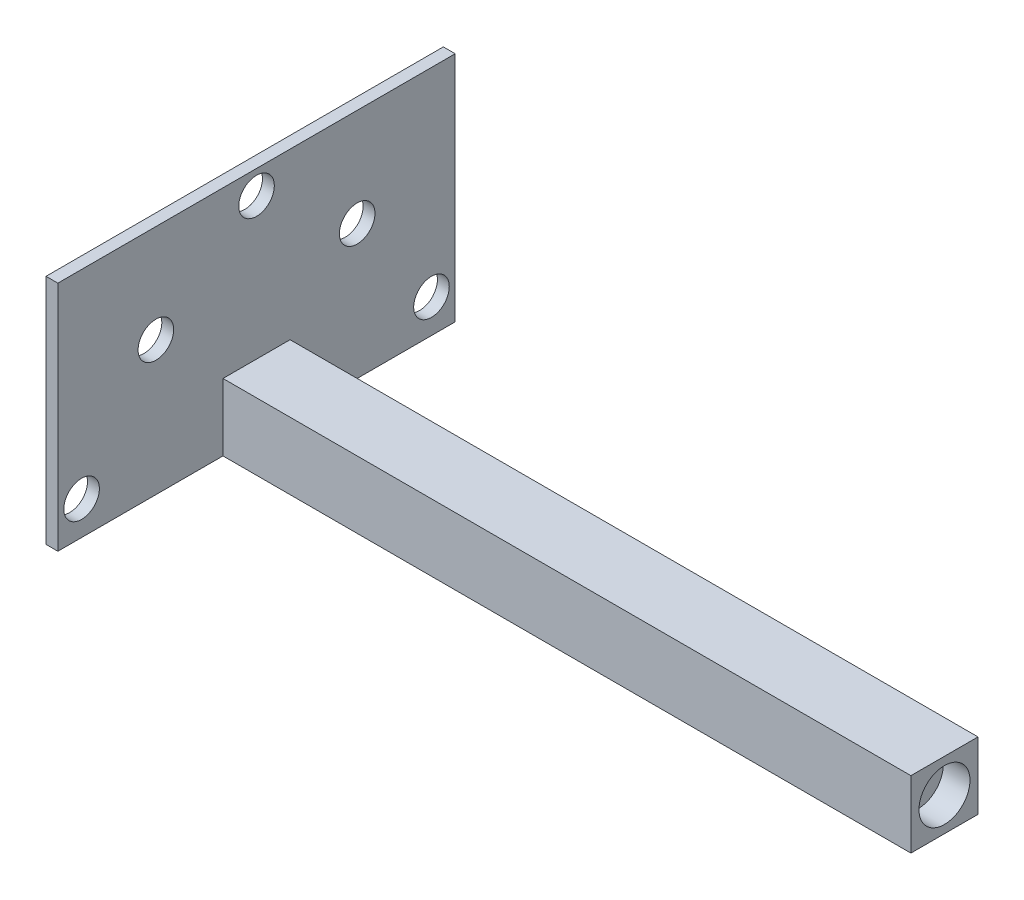
ISO-10303-21;
HEADER;
FILE_DESCRIPTION(('STEP AP214'),'2;1');
FILE_NAME('part.step','',(''),(''),'','','');
FILE_SCHEMA(('AUTOMOTIVE_DESIGN { 1 0 10303 214 1 1 1 1 }'));
ENDSEC;
DATA;
#1=APPLICATION_CONTEXT('core data for automotive mechanical design processes');
#2=APPLICATION_PROTOCOL_DEFINITION('international standard','automotive_design',2000,#1);
#3=PRODUCT_CONTEXT('',#1,'mechanical');
#4=PRODUCT('Part','Part','',(#3));
#5=PRODUCT_RELATED_PRODUCT_CATEGORY('part','',(#4));
#6=PRODUCT_DEFINITION_FORMATION('','',#4);
#7=PRODUCT_DEFINITION_CONTEXT('part definition',#1,'design');
#8=PRODUCT_DEFINITION('design','',#6,#7);
#9=PRODUCT_DEFINITION_SHAPE('','',#8);
#10=(LENGTH_UNIT() NAMED_UNIT(*) SI_UNIT(.MILLI.,.METRE.));
#11=(NAMED_UNIT(*) PLANE_ANGLE_UNIT() SI_UNIT($,.RADIAN.));
#12=(NAMED_UNIT(*) SI_UNIT($,.STERADIAN.) SOLID_ANGLE_UNIT());
#13=UNCERTAINTY_MEASURE_WITH_UNIT(LENGTH_MEASURE(1.E-05),#10,'distance_accuracy_value','');
#14=(GEOMETRIC_REPRESENTATION_CONTEXT(3) GLOBAL_UNCERTAINTY_ASSIGNED_CONTEXT((#13)) GLOBAL_UNIT_ASSIGNED_CONTEXT((#10,
#11,#12)) REPRESENTATION_CONTEXT('',''));
#15=CARTESIAN_POINT('',(0.,0.,0.));
#16=DIRECTION('',(0.,0.,1.));
#17=DIRECTION('',(1.,0.,0.));
#18=AXIS2_PLACEMENT_3D('',#15,#16,#17);
#19=CARTESIAN_POINT('',(1.,0.,0.));
#20=DIRECTION('',(1.,0.,0.));
#21=DIRECTION('',(0.,0.,-1.));
#22=AXIS2_PLACEMENT_3D('',#19,#20,#21);
#23=PLANE('',#22);
#24=CARTESIAN_POINT('',(1.,8.48528137423854,-8.4852813742386));
#25=DIRECTION('',(1.,0.,0.));
#26=DIRECTION('',(0.,0.,-1.));
#27=AXIS2_PLACEMENT_3D('',#24,#25,#26);
#28=CIRCLE('',#27,1.5);
#29=CARTESIAN_POINT('',(1.,8.48528137423854,-9.9852813742386));
#30=VERTEX_POINT('',#29);
#31=EDGE_CURVE('E139',#30,#30,#28,.T.);
#32=ORIENTED_EDGE('',*,*,#31,.F.);
#33=EDGE_LOOP('',(#32));
#34=FACE_BOUND('',#33,.T.);
#35=CARTESIAN_POINT('',(1.,8.48528137423857,8.48528137423857));
#36=DIRECTION('',(1.,0.,0.));
#37=DIRECTION('',(0.,0.,-1.));
#38=AXIS2_PLACEMENT_3D('',#35,#36,#37);
#39=CIRCLE('',#38,1.5);
#40=CARTESIAN_POINT('',(1.,8.48528137423857,6.98528137423857));
#41=VERTEX_POINT('',#40);
#42=EDGE_CURVE('E142',#41,#41,#39,.T.);
#43=ORIENTED_EDGE('',*,*,#42,.F.);
#44=EDGE_LOOP('',(#43));
#45=FACE_BOUND('',#44,.T.);
#46=CARTESIAN_POINT('',(1.,0.,14.75));
#47=DIRECTION('',(1.,0.,0.));
#48=DIRECTION('',(0.,0.,-1.));
#49=AXIS2_PLACEMENT_3D('',#46,#47,#48);
#50=CIRCLE('',#49,1.5);
#51=CARTESIAN_POINT('',(1.,0.,13.25));
#52=VERTEX_POINT('',#51);
#53=EDGE_CURVE('E146',#52,#52,#50,.T.);
#54=ORIENTED_EDGE('',*,*,#53,.F.);
#55=EDGE_LOOP('',(#54));
#56=FACE_BOUND('',#55,.T.);
#57=CARTESIAN_POINT('',(1.,0.,-14.75));
#58=DIRECTION('',(1.,0.,0.));
#59=DIRECTION('',(0.,0.,-1.));
#60=AXIS2_PLACEMENT_3D('',#57,#58,#59);
#61=CIRCLE('',#60,1.5);
#62=CARTESIAN_POINT('',(1.,0.,-16.25));
#63=VERTEX_POINT('',#62);
#64=EDGE_CURVE('E149',#63,#63,#61,.T.);
#65=ORIENTED_EDGE('',*,*,#64,.F.);
#66=EDGE_LOOP('',(#65));
#67=FACE_BOUND('',#66,.T.);
#68=CARTESIAN_POINT('',(1.,14.75,0.));
#69=DIRECTION('',(1.,0.,0.));
#70=DIRECTION('',(0.,0.,-1.));
#71=AXIS2_PLACEMENT_3D('',#68,#69,#70);
#72=CIRCLE('',#71,1.5);
#73=CARTESIAN_POINT('',(1.,14.75,-1.5));
#74=VERTEX_POINT('',#73);
#75=EDGE_CURVE('E152',#74,#74,#72,.T.);
#76=ORIENTED_EDGE('',*,*,#75,.F.);
#77=EDGE_LOOP('',(#76));
#78=FACE_BOUND('',#77,.T.);
#79=DIRECTION('',(0.,0.,1.));
#80=VECTOR('',#79,1.);
#81=CARTESIAN_POINT('',(1.,2.82842712474619,0.));
#82=LINE('',#81,#80);
#83=CARTESIAN_POINT('',(1.,2.82842712474619,-2.82842712474619));
#84=VERTEX_POINT('',#83);
#85=CARTESIAN_POINT('',(1.,2.82842712474619,2.82842712474619));
#86=VERTEX_POINT('',#85);
#87=EDGE_CURVE('E56',#84,#86,#82,.T.);
#88=ORIENTED_EDGE('',*,*,#87,.F.);
#89=DIRECTION('',(0.,-1.,0.));
#90=VECTOR('',#89,1.);
#91=CARTESIAN_POINT('',(1.,0.,-2.82842712474619));
#92=LINE('',#91,#90);
#93=CARTESIAN_POINT('',(1.,-2.82842712474619,-2.82842712474619));
#94=VERTEX_POINT('',#93);
#95=EDGE_CURVE('E136',#84,#94,#92,.T.);
#96=ORIENTED_EDGE('',*,*,#95,.T.);
#97=DIRECTION('',(0.,0.,-1.));
#98=VECTOR('',#97,1.);
#99=CARTESIAN_POINT('',(1.,-2.82842712474619,0.));
#100=LINE('',#99,#98);
#101=CARTESIAN_POINT('',(1.,-2.82842712474619,-16.75));
#102=VERTEX_POINT('',#101);
#103=EDGE_CURVE('E128',#94,#102,#100,.T.);
#104=ORIENTED_EDGE('',*,*,#103,.T.);
#105=DIRECTION('',(0.,1.,0.));
#106=VECTOR('',#105,1.);
#107=CARTESIAN_POINT('',(1.,0.,-16.75));
#108=LINE('',#107,#106);
#109=CARTESIAN_POINT('',(1.,16.75,-16.75));
#110=VERTEX_POINT('',#109);
#111=EDGE_CURVE('E160',#102,#110,#108,.T.);
#112=ORIENTED_EDGE('',*,*,#111,.T.);
#113=DIRECTION('',(0.,0.,-1.));
#114=VECTOR('',#113,1.);
#115=CARTESIAN_POINT('',(1.,16.75,0.));
#116=LINE('',#115,#114);
#117=CARTESIAN_POINT('',(1.,16.75,16.75));
#118=VERTEX_POINT('',#117);
#119=EDGE_CURVE('E162',#118,#110,#116,.T.);
#120=ORIENTED_EDGE('',*,*,#119,.F.);
#121=DIRECTION('',(0.,1.,0.));
#122=VECTOR('',#121,1.);
#123=CARTESIAN_POINT('',(1.,0.,16.75));
#124=LINE('',#123,#122);
#125=CARTESIAN_POINT('',(1.,-2.82842712474619,16.75));
#126=VERTEX_POINT('',#125);
#127=EDGE_CURVE('E155',#126,#118,#124,.T.);
#128=ORIENTED_EDGE('',*,*,#127,.F.);
#129=CARTESIAN_POINT('',(1.,-2.82842712474619,2.82842712474619));
#130=VERTEX_POINT('',#129);
#131=EDGE_CURVE('E158',#126,#130,#100,.T.);
#132=ORIENTED_EDGE('',*,*,#131,.T.);
#133=DIRECTION('',(0.,-1.,0.));
#134=VECTOR('',#133,1.);
#135=CARTESIAN_POINT('',(1.,0.,2.82842712474619));
#136=LINE('',#135,#134);
#137=EDGE_CURVE('E61',#86,#130,#136,.T.);
#138=ORIENTED_EDGE('',*,*,#137,.F.);
#139=EDGE_LOOP('',(#88,#96,#104,#112,#120,#128,#132,#138));
#140=FACE_BOUND('',#139,.T.);
#141=ADVANCED_FACE('F41',(#34,#45,#56,#67,#78,#140),#23,.T.);
#142=CARTESIAN_POINT('',(1.,0.,16.75));
#143=DIRECTION('',(0.,0.,1.));
#144=DIRECTION('',(1.,0.,0.));
#145=AXIS2_PLACEMENT_3D('',#142,#143,#144);
#146=PLANE('',#145);
#147=DIRECTION('',(0.,1.,0.));
#148=VECTOR('',#147,1.);
#149=CARTESIAN_POINT('',(0.,0.,16.75));
#150=LINE('',#149,#148);
#151=CARTESIAN_POINT('',(0.,-2.82842712474619,16.75));
#152=VERTEX_POINT('',#151);
#153=CARTESIAN_POINT('',(0.,16.75,16.75));
#154=VERTEX_POINT('',#153);
#155=EDGE_CURVE('E180',#152,#154,#150,.T.);
#156=ORIENTED_EDGE('',*,*,#155,.F.);
#157=DIRECTION('',(-1.,0.,0.));
#158=VECTOR('',#157,1.);
#159=CARTESIAN_POINT('',(1.,-2.82842712474619,16.75));
#160=LINE('',#159,#158);
#161=EDGE_CURVE('E11',#126,#152,#160,.T.);
#162=ORIENTED_EDGE('',*,*,#161,.F.);
#163=ORIENTED_EDGE('',*,*,#127,.T.);
#164=DIRECTION('',(-1.,0.,0.));
#165=VECTOR('',#164,1.);
#166=CARTESIAN_POINT('',(1.,16.75,16.75));
#167=LINE('',#166,#165);
#168=EDGE_CURVE('E165',#118,#154,#167,.T.);
#169=ORIENTED_EDGE('',*,*,#168,.T.);
#170=EDGE_LOOP('',(#156,#162,#163,#169));
#171=FACE_BOUND('',#170,.T.);
#172=ADVANCED_FACE('F229',(#171),#146,.T.);
#173=CARTESIAN_POINT('',(1.,-2.82842712474619,0.));
#174=DIRECTION('',(0.,1.,0.));
#175=DIRECTION('',(0.,0.,1.));
#176=AXIS2_PLACEMENT_3D('',#173,#174,#175);
#177=PLANE('',#176);
#178=DIRECTION('',(0.,0.,-1.));
#179=VECTOR('',#178,1.);
#180=CARTESIAN_POINT('',(0.,-2.82842712474619,0.));
#181=LINE('',#180,#179);
#182=CARTESIAN_POINT('',(0.,-2.82842712474619,-16.75));
#183=VERTEX_POINT('',#182);
#184=EDGE_CURVE('E183',#152,#183,#181,.T.);
#185=ORIENTED_EDGE('',*,*,#184,.T.);
#186=DIRECTION('',(-1.,0.,0.));
#187=VECTOR('',#186,1.);
#188=CARTESIAN_POINT('',(1.,-2.82842712474619,-16.75));
#189=LINE('',#188,#187);
#190=EDGE_CURVE('E49',#102,#183,#189,.T.);
#191=ORIENTED_EDGE('',*,*,#190,.F.);
#192=ORIENTED_EDGE('',*,*,#103,.F.);
#193=DIRECTION('',(-1.,0.,0.));
#194=VECTOR('',#193,1.);
#195=CARTESIAN_POINT('',(59.,-2.82842712474619,-2.82842712474619));
#196=LINE('',#195,#194);
#197=CARTESIAN_POINT('',(59.,-2.82842712474619,-2.82842712474619));
#198=VERTEX_POINT('',#197);
#199=EDGE_CURVE('E107',#198,#94,#196,.T.);
#200=ORIENTED_EDGE('',*,*,#199,.F.);
#201=DIRECTION('',(0.,0.,-1.));
#202=VECTOR('',#201,1.);
#203=CARTESIAN_POINT('',(59.,-2.82842712474619,0.));
#204=LINE('',#203,#202);
#205=CARTESIAN_POINT('',(59.,-2.82842712474619,2.82842712474619));
#206=VERTEX_POINT('',#205);
#207=EDGE_CURVE('E114',#206,#198,#204,.T.);
#208=ORIENTED_EDGE('',*,*,#207,.F.);
#209=DIRECTION('',(-1.,0.,0.));
#210=VECTOR('',#209,1.);
#211=CARTESIAN_POINT('',(59.,-2.82842712474619,2.82842712474619));
#212=LINE('',#211,#210);
#213=EDGE_CURVE('E213',#206,#130,#212,.T.);
#214=ORIENTED_EDGE('',*,*,#213,.T.);
#215=ORIENTED_EDGE('',*,*,#131,.F.);
#216=ORIENTED_EDGE('',*,*,#161,.T.);
#217=EDGE_LOOP('',(#185,#191,#192,#200,#208,#214,#215,#216));
#218=FACE_BOUND('',#217,.T.);
#219=ADVANCED_FACE('F126',(#218),#177,.F.);
#220=CARTESIAN_POINT('',(1.,0.,-16.75));
#221=DIRECTION('',(0.,0.,1.));
#222=DIRECTION('',(1.,0.,0.));
#223=AXIS2_PLACEMENT_3D('',#220,#221,#222);
#224=PLANE('',#223);
#225=DIRECTION('',(0.,1.,0.));
#226=VECTOR('',#225,1.);
#227=CARTESIAN_POINT('',(0.,0.,-16.75));
#228=LINE('',#227,#226);
#229=CARTESIAN_POINT('',(0.,16.75,-16.75));
#230=VERTEX_POINT('',#229);
#231=EDGE_CURVE('E185',#183,#230,#228,.T.);
#232=ORIENTED_EDGE('',*,*,#231,.T.);
#233=DIRECTION('',(-1.,0.,0.));
#234=VECTOR('',#233,1.);
#235=CARTESIAN_POINT('',(1.,16.75,-16.75));
#236=LINE('',#235,#234);
#237=EDGE_CURVE('E191',#110,#230,#236,.T.);
#238=ORIENTED_EDGE('',*,*,#237,.F.);
#239=ORIENTED_EDGE('',*,*,#111,.F.);
#240=ORIENTED_EDGE('',*,*,#190,.T.);
#241=EDGE_LOOP('',(#232,#238,#239,#240));
#242=FACE_BOUND('',#241,.T.);
#243=ADVANCED_FACE('F195',(#242),#224,.F.);
#244=CARTESIAN_POINT('',(1.,14.75,0.));
#245=DIRECTION('',(-1.,0.,0.));
#246=DIRECTION('',(0.,0.,1.));
#247=AXIS2_PLACEMENT_3D('',#244,#245,#246);
#248=CYLINDRICAL_SURFACE('',#247,1.5);
#249=ORIENTED_EDGE('',*,*,#75,.T.);
#250=EDGE_LOOP('',(#249));
#251=FACE_BOUND('',#250,.T.);
#252=CARTESIAN_POINT('',(0.,14.75,0.));
#253=DIRECTION('',(1.,0.,0.));
#254=DIRECTION('',(0.,0.,-1.));
#255=AXIS2_PLACEMENT_3D('',#252,#253,#254);
#256=CIRCLE('',#255,1.5);
#257=CARTESIAN_POINT('',(0.,14.75,-1.5));
#258=VERTEX_POINT('',#257);
#259=EDGE_CURVE('E177',#258,#258,#256,.T.);
#260=ORIENTED_EDGE('',*,*,#259,.F.);
#261=EDGE_LOOP('',(#260));
#262=FACE_BOUND('',#261,.T.);
#263=ADVANCED_FACE('F248',(#251,#262),#248,.F.);
#264=CARTESIAN_POINT('',(1.,0.,-14.75));
#265=DIRECTION('',(-1.,0.,0.));
#266=DIRECTION('',(0.,0.,1.));
#267=AXIS2_PLACEMENT_3D('',#264,#265,#266);
#268=CYLINDRICAL_SURFACE('',#267,1.5);
#269=ORIENTED_EDGE('',*,*,#64,.T.);
#270=EDGE_LOOP('',(#269));
#271=FACE_BOUND('',#270,.T.);
#272=CARTESIAN_POINT('',(0.,0.,-14.75));
#273=DIRECTION('',(1.,0.,0.));
#274=DIRECTION('',(0.,0.,-1.));
#275=AXIS2_PLACEMENT_3D('',#272,#273,#274);
#276=CIRCLE('',#275,1.5);
#277=CARTESIAN_POINT('',(0.,0.,-16.25));
#278=VERTEX_POINT('',#277);
#279=EDGE_CURVE('E174',#278,#278,#276,.T.);
#280=ORIENTED_EDGE('',*,*,#279,.F.);
#281=EDGE_LOOP('',(#280));
#282=FACE_BOUND('',#281,.T.);
#283=ADVANCED_FACE('F252',(#271,#282),#268,.F.);
#284=CARTESIAN_POINT('',(1.,0.,14.75));
#285=DIRECTION('',(-1.,0.,0.));
#286=DIRECTION('',(0.,0.,1.));
#287=AXIS2_PLACEMENT_3D('',#284,#285,#286);
#288=CYLINDRICAL_SURFACE('',#287,1.5);
#289=ORIENTED_EDGE('',*,*,#53,.T.);
#290=EDGE_LOOP('',(#289));
#291=FACE_BOUND('',#290,.T.);
#292=CARTESIAN_POINT('',(0.,0.,14.75));
#293=DIRECTION('',(1.,0.,0.));
#294=DIRECTION('',(0.,0.,-1.));
#295=AXIS2_PLACEMENT_3D('',#292,#293,#294);
#296=CIRCLE('',#295,1.5);
#297=CARTESIAN_POINT('',(0.,0.,13.25));
#298=VERTEX_POINT('',#297);
#299=EDGE_CURVE('E171',#298,#298,#296,.T.);
#300=ORIENTED_EDGE('',*,*,#299,.F.);
#301=EDGE_LOOP('',(#300));
#302=FACE_BOUND('',#301,.T.);
#303=ADVANCED_FACE('F256',(#291,#302),#288,.F.);
#304=CARTESIAN_POINT('',(1.,8.48528137423857,8.48528137423857));
#305=DIRECTION('',(-1.,0.,0.));
#306=DIRECTION('',(0.,0.,1.));
#307=AXIS2_PLACEMENT_3D('',#304,#305,#306);
#308=CYLINDRICAL_SURFACE('',#307,1.5);
#309=ORIENTED_EDGE('',*,*,#42,.T.);
#310=EDGE_LOOP('',(#309));
#311=FACE_BOUND('',#310,.T.);
#312=CARTESIAN_POINT('',(0.,8.48528137423857,8.48528137423857));
#313=DIRECTION('',(1.,0.,0.));
#314=DIRECTION('',(0.,0.,-1.));
#315=AXIS2_PLACEMENT_3D('',#312,#313,#314);
#316=CIRCLE('',#315,1.5);
#317=CARTESIAN_POINT('',(0.,8.48528137423857,6.98528137423857));
#318=VERTEX_POINT('',#317);
#319=EDGE_CURVE('E168',#318,#318,#316,.T.);
#320=ORIENTED_EDGE('',*,*,#319,.F.);
#321=EDGE_LOOP('',(#320));
#322=FACE_BOUND('',#321,.T.);
#323=ADVANCED_FACE('F259',(#311,#322),#308,.F.);
#324=CARTESIAN_POINT('',(1.,8.48528137423854,-8.4852813742386));
#325=DIRECTION('',(-1.,0.,0.));
#326=DIRECTION('',(0.,0.,1.));
#327=AXIS2_PLACEMENT_3D('',#324,#325,#326);
#328=CYLINDRICAL_SURFACE('',#327,1.5);
#329=ORIENTED_EDGE('',*,*,#31,.T.);
#330=EDGE_LOOP('',(#329));
#331=FACE_BOUND('',#330,.T.);
#332=CARTESIAN_POINT('',(0.,8.48528137423854,-8.4852813742386));
#333=DIRECTION('',(1.,0.,0.));
#334=DIRECTION('',(0.,0.,-1.));
#335=AXIS2_PLACEMENT_3D('',#332,#333,#334);
#336=CIRCLE('',#335,1.5);
#337=CARTESIAN_POINT('',(0.,8.48528137423854,-9.9852813742386));
#338=VERTEX_POINT('',#337);
#339=EDGE_CURVE('E138',#338,#338,#336,.T.);
#340=ORIENTED_EDGE('',*,*,#339,.F.);
#341=EDGE_LOOP('',(#340));
#342=FACE_BOUND('',#341,.T.);
#343=ADVANCED_FACE('F43',(#331,#342),#328,.F.);
#344=CARTESIAN_POINT('',(1.,16.75,0.));
#345=DIRECTION('',(0.,1.,0.));
#346=DIRECTION('',(0.,0.,1.));
#347=AXIS2_PLACEMENT_3D('',#344,#345,#346);
#348=PLANE('',#347);
#349=DIRECTION('',(0.,0.,-1.));
#350=VECTOR('',#349,1.);
#351=CARTESIAN_POINT('',(0.,16.75,0.));
#352=LINE('',#351,#350);
#353=EDGE_CURVE('E143',#154,#230,#352,.T.);
#354=ORIENTED_EDGE('',*,*,#353,.F.);
#355=ORIENTED_EDGE('',*,*,#168,.F.);
#356=ORIENTED_EDGE('',*,*,#119,.T.);
#357=ORIENTED_EDGE('',*,*,#237,.T.);
#358=EDGE_LOOP('',(#354,#355,#356,#357));
#359=FACE_BOUND('',#358,.T.);
#360=ADVANCED_FACE('F206',(#359),#348,.T.);
#361=CARTESIAN_POINT('',(0.,0.,0.));
#362=DIRECTION('',(1.,0.,0.));
#363=DIRECTION('',(0.,0.,-1.));
#364=AXIS2_PLACEMENT_3D('',#361,#362,#363);
#365=PLANE('',#364);
#366=ORIENTED_EDGE('',*,*,#231,.F.);
#367=ORIENTED_EDGE('',*,*,#184,.F.);
#368=ORIENTED_EDGE('',*,*,#155,.T.);
#369=ORIENTED_EDGE('',*,*,#353,.T.);
#370=EDGE_LOOP('',(#366,#367,#368,#369));
#371=FACE_BOUND('',#370,.T.);
#372=ORIENTED_EDGE('',*,*,#259,.T.);
#373=EDGE_LOOP('',(#372));
#374=FACE_BOUND('',#373,.T.);
#375=ORIENTED_EDGE('',*,*,#279,.T.);
#376=EDGE_LOOP('',(#375));
#377=FACE_BOUND('',#376,.T.);
#378=ORIENTED_EDGE('',*,*,#299,.T.);
#379=EDGE_LOOP('',(#378));
#380=FACE_BOUND('',#379,.T.);
#381=ORIENTED_EDGE('',*,*,#319,.T.);
#382=EDGE_LOOP('',(#381));
#383=FACE_BOUND('',#382,.T.);
#384=ORIENTED_EDGE('',*,*,#339,.T.);
#385=EDGE_LOOP('',(#384));
#386=FACE_BOUND('',#385,.T.);
#387=ADVANCED_FACE('F202',(#371,#374,#377,#380,#383,#386),#365,.F.);
#388=CARTESIAN_POINT('',(59.,0.,-2.82842712474619));
#389=DIRECTION('',(0.,0.,1.));
#390=DIRECTION('',(1.,0.,0.));
#391=AXIS2_PLACEMENT_3D('',#388,#389,#390);
#392=PLANE('',#391);
#393=ORIENTED_EDGE('',*,*,#95,.F.);
#394=DIRECTION('',(-1.,0.,0.));
#395=VECTOR('',#394,1.);
#396=CARTESIAN_POINT('',(59.,2.82842712474619,-2.82842712474619));
#397=LINE('',#396,#395);
#398=CARTESIAN_POINT('',(59.,2.82842712474619,-2.82842712474619));
#399=VERTEX_POINT('',#398);
#400=EDGE_CURVE('E109',#399,#84,#397,.T.);
#401=ORIENTED_EDGE('',*,*,#400,.F.);
#402=DIRECTION('',(0.,1.,0.));
#403=VECTOR('',#402,1.);
#404=CARTESIAN_POINT('',(59.,0.,-2.82842712474619));
#405=LINE('',#404,#403);
#406=EDGE_CURVE('E103',#198,#399,#405,.T.);
#407=ORIENTED_EDGE('',*,*,#406,.F.);
#408=ORIENTED_EDGE('',*,*,#199,.T.);
#409=EDGE_LOOP('',(#393,#401,#407,#408));
#410=FACE_BOUND('',#409,.T.);
#411=ADVANCED_FACE('F105',(#410),#392,.F.);
#412=CARTESIAN_POINT('',(59.,2.82842712474619,0.));
#413=DIRECTION('',(0.,1.,0.));
#414=DIRECTION('',(0.,0.,1.));
#415=AXIS2_PLACEMENT_3D('',#412,#413,#414);
#416=PLANE('',#415);
#417=ORIENTED_EDGE('',*,*,#400,.T.);
#418=ORIENTED_EDGE('',*,*,#87,.T.);
#419=DIRECTION('',(-1.,0.,0.));
#420=VECTOR('',#419,1.);
#421=CARTESIAN_POINT('',(59.,2.82842712474619,2.82842712474619));
#422=LINE('',#421,#420);
#423=CARTESIAN_POINT('',(59.,2.82842712474619,2.82842712474619));
#424=VERTEX_POINT('',#423);
#425=EDGE_CURVE('E131',#424,#86,#422,.T.);
#426=ORIENTED_EDGE('',*,*,#425,.F.);
#427=DIRECTION('',(0.,0.,-1.));
#428=VECTOR('',#427,1.);
#429=CARTESIAN_POINT('',(59.,2.82842712474619,0.));
#430=LINE('',#429,#428);
#431=EDGE_CURVE('E113',#424,#399,#430,.T.);
#432=ORIENTED_EDGE('',*,*,#431,.T.);
#433=EDGE_LOOP('',(#417,#418,#426,#432));
#434=FACE_BOUND('',#433,.T.);
#435=ADVANCED_FACE('F210',(#434),#416,.T.);
#436=CARTESIAN_POINT('',(59.,0.,2.82842712474619));
#437=DIRECTION('',(0.,0.,1.));
#438=DIRECTION('',(1.,0.,0.));
#439=AXIS2_PLACEMENT_3D('',#436,#437,#438);
#440=PLANE('',#439);
#441=ORIENTED_EDGE('',*,*,#425,.T.);
#442=ORIENTED_EDGE('',*,*,#137,.T.);
#443=ORIENTED_EDGE('',*,*,#213,.F.);
#444=DIRECTION('',(0.,1.,0.));
#445=VECTOR('',#444,1.);
#446=CARTESIAN_POINT('',(59.,0.,2.82842712474619));
#447=LINE('',#446,#445);
#448=EDGE_CURVE('E120',#206,#424,#447,.T.);
#449=ORIENTED_EDGE('',*,*,#448,.T.);
#450=EDGE_LOOP('',(#441,#442,#443,#449));
#451=FACE_BOUND('',#450,.T.);
#452=ADVANCED_FACE('F217',(#451),#440,.T.);
#453=CARTESIAN_POINT('',(59.,0.,0.));
#454=DIRECTION('',(1.,0.,0.));
#455=DIRECTION('',(0.,0.,-1.));
#456=AXIS2_PLACEMENT_3D('',#453,#454,#455);
#457=PLANE('',#456);
#458=CARTESIAN_POINT('',(59.,0.,0.));
#459=DIRECTION('',(1.,0.,0.));
#460=DIRECTION('',(0.,0.,-1.));
#461=AXIS2_PLACEMENT_3D('',#458,#459,#460);
#462=CIRCLE('',#461,2.15);
#463=CARTESIAN_POINT('',(59.,0.,-2.15));
#464=VERTEX_POINT('',#463);
#465=EDGE_CURVE('E371',#464,#464,#462,.T.);
#466=ORIENTED_EDGE('',*,*,#465,.F.);
#467=EDGE_LOOP('',(#466));
#468=FACE_BOUND('',#467,.T.);
#469=ORIENTED_EDGE('',*,*,#207,.T.);
#470=ORIENTED_EDGE('',*,*,#406,.T.);
#471=ORIENTED_EDGE('',*,*,#431,.F.);
#472=ORIENTED_EDGE('',*,*,#448,.F.);
#473=EDGE_LOOP('',(#469,#470,#471,#472));
#474=FACE_BOUND('',#473,.T.);
#475=ADVANCED_FACE('F118',(#468,#474),#457,.T.);
#476=CARTESIAN_POINT('',(56.75,0.,0.));
#477=DIRECTION('',(1.,0.,0.));
#478=DIRECTION('',(0.,0.,-1.));
#479=AXIS2_PLACEMENT_3D('',#476,#477,#478);
#480=CYLINDRICAL_SURFACE('',#479,2.15);
#481=CARTESIAN_POINT('',(56.75,0.,0.));
#482=DIRECTION('',(1.,0.,0.));
#483=DIRECTION('',(0.,0.,-1.));
#484=AXIS2_PLACEMENT_3D('',#481,#482,#483);
#485=CIRCLE('',#484,2.15);
#486=CARTESIAN_POINT('',(56.75,0.,-2.15));
#487=VERTEX_POINT('',#486);
#488=EDGE_CURVE('E123',#487,#487,#485,.T.);
#489=ORIENTED_EDGE('',*,*,#488,.F.);
#490=EDGE_LOOP('',(#489));
#491=FACE_BOUND('',#490,.T.);
#492=ORIENTED_EDGE('',*,*,#465,.T.);
#493=EDGE_LOOP('',(#492));
#494=FACE_BOUND('',#493,.T.);
#495=ADVANCED_FACE('F224',(#491,#494),#480,.F.);
#496=CARTESIAN_POINT('',(56.75,0.,0.));
#497=DIRECTION('',(1.,0.,0.));
#498=DIRECTION('',(0.,0.,-1.));
#499=AXIS2_PLACEMENT_3D('',#496,#497,#498);
#500=PLANE('',#499);
#501=ORIENTED_EDGE('',*,*,#488,.T.);
#502=EDGE_LOOP('',(#501));
#503=FACE_BOUND('',#502,.T.);
#504=ADVANCED_FACE('F356',(#503),#500,.T.);
#505=CLOSED_SHELL('',(#141,#172,#219,#243,#263,#283,#303,#323,#343,#360,#387,#411,#435,#452,
#475,#495,#504));
#506=MANIFOLD_SOLID_BREP('B2',#505);
#507=ADVANCED_BREP_SHAPE_REPRESENTATION('',(#18,#506),#14);
#508=SHAPE_DEFINITION_REPRESENTATION(#9,#507);
ENDSEC;
END-ISO-10303-21;
